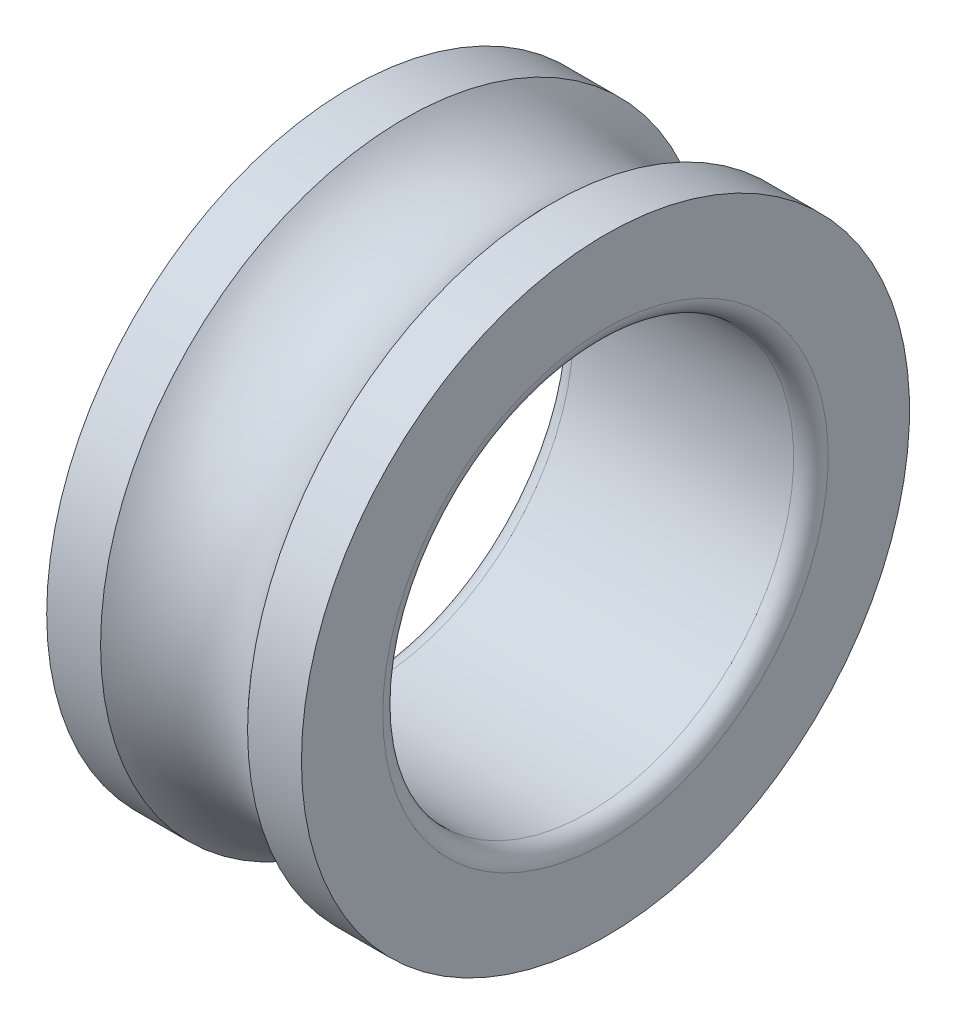
ISO-10303-21;
HEADER;
FILE_DESCRIPTION(('STEP AP214'),'2;1');
FILE_NAME('part.step','',(''),(''),'','','');
FILE_SCHEMA(('AUTOMOTIVE_DESIGN { 1 0 10303 214 1 1 1 1 }'));
ENDSEC;
DATA;
#1=APPLICATION_CONTEXT('core data for automotive mechanical design processes');
#2=APPLICATION_PROTOCOL_DEFINITION('international standard','automotive_design',2000,#1);
#3=PRODUCT_CONTEXT('',#1,'mechanical');
#4=PRODUCT('Part','Part','',(#3));
#5=PRODUCT_RELATED_PRODUCT_CATEGORY('part','',(#4));
#6=PRODUCT_DEFINITION_FORMATION('','',#4);
#7=PRODUCT_DEFINITION_CONTEXT('part definition',#1,'design');
#8=PRODUCT_DEFINITION('design','',#6,#7);
#9=PRODUCT_DEFINITION_SHAPE('','',#8);
#10=(LENGTH_UNIT() NAMED_UNIT(*) SI_UNIT(.MILLI.,.METRE.));
#11=(NAMED_UNIT(*) PLANE_ANGLE_UNIT() SI_UNIT($,.RADIAN.));
#12=(NAMED_UNIT(*) SI_UNIT($,.STERADIAN.) SOLID_ANGLE_UNIT());
#13=UNCERTAINTY_MEASURE_WITH_UNIT(LENGTH_MEASURE(1.E-05),#10,'distance_accuracy_value','');
#14=(GEOMETRIC_REPRESENTATION_CONTEXT(3) GLOBAL_UNCERTAINTY_ASSIGNED_CONTEXT((#13)) GLOBAL_UNIT_ASSIGNED_CONTEXT((#10,
#11,#12)) REPRESENTATION_CONTEXT('',''));
#15=CARTESIAN_POINT('',(0.,0.,0.));
#16=DIRECTION('',(0.,0.,1.));
#17=DIRECTION('',(1.,0.,0.));
#18=AXIS2_PLACEMENT_3D('',#15,#16,#17);
#19=CARTESIAN_POINT('',(-15.5,37.,0.));
#20=DIRECTION('',(1.,0.,0.));
#21=DIRECTION('',(0.,0.,-1.));
#22=AXIS2_PLACEMENT_3D('',#19,#20,#21);
#23=PLANE('',#22);
#24=CARTESIAN_POINT('',(-15.5,0.,0.));
#25=DIRECTION('',(-1.,0.,0.));
#26=DIRECTION('',(0.,0.,1.));
#27=AXIS2_PLACEMENT_3D('',#24,#25,#26);
#28=CIRCLE('',#27,27.1);
#29=CARTESIAN_POINT('',(-15.5,0.,27.1));
#30=VERTEX_POINT('',#29);
#31=EDGE_CURVE('E10',#30,#30,#28,.T.);
#32=ORIENTED_EDGE('',*,*,#31,.F.);
#33=EDGE_LOOP('',(#32));
#34=FACE_BOUND('',#33,.T.);
#35=CARTESIAN_POINT('',(-15.5,0.,0.));
#36=DIRECTION('',(-1.,0.,0.));
#37=DIRECTION('',(0.,0.,1.));
#38=AXIS2_PLACEMENT_3D('',#35,#36,#37);
#39=CIRCLE('',#38,37.);
#40=CARTESIAN_POINT('',(-15.5,0.,37.));
#41=VERTEX_POINT('',#40);
#42=EDGE_CURVE('E72',#41,#41,#39,.T.);
#43=ORIENTED_EDGE('',*,*,#42,.T.);
#44=EDGE_LOOP('',(#43));
#45=FACE_BOUND('',#44,.T.);
#46=ADVANCED_FACE('F37',(#34,#45),#23,.F.);
#47=CARTESIAN_POINT('',(-13.4,0.,0.));
#48=DIRECTION('',(-1.,0.,0.));
#49=DIRECTION('',(0.,0.,1.));
#50=AXIS2_PLACEMENT_3D('',#47,#48,#49);
#51=TOROIDAL_SURFACE('',#50,27.1,2.1);
#52=CARTESIAN_POINT('',(-13.4,0.,0.));
#53=DIRECTION('',(-1.,0.,0.));
#54=DIRECTION('',(0.,0.,1.));
#55=AXIS2_PLACEMENT_3D('',#52,#53,#54);
#56=CIRCLE('',#55,25.);
#57=CARTESIAN_POINT('',(-13.4,0.,25.));
#58=VERTEX_POINT('',#57);
#59=EDGE_CURVE('E44',#58,#58,#56,.T.);
#60=ORIENTED_EDGE('',*,*,#59,.F.);
#61=EDGE_LOOP('',(#60));
#62=FACE_BOUND('',#61,.T.);
#63=ORIENTED_EDGE('',*,*,#31,.T.);
#64=EDGE_LOOP('',(#63));
#65=FACE_BOUND('',#64,.T.);
#66=ADVANCED_FACE('F110',(#62,#65),#51,.T.);
#67=CARTESIAN_POINT('',(-22.7189323431548,0.,0.));
#68=DIRECTION('',(-1.,0.,0.));
#69=DIRECTION('',(0.,0.,1.));
#70=AXIS2_PLACEMENT_3D('',#67,#68,#69);
#71=CYLINDRICAL_SURFACE('',#70,25.);
#72=CARTESIAN_POINT('',(13.4,0.,0.));
#73=DIRECTION('',(-1.,0.,0.));
#74=DIRECTION('',(0.,0.,1.));
#75=AXIS2_PLACEMENT_3D('',#72,#73,#74);
#76=CIRCLE('',#75,25.);
#77=CARTESIAN_POINT('',(13.4,0.,25.));
#78=VERTEX_POINT('',#77);
#79=EDGE_CURVE('E49',#78,#78,#76,.T.);
#80=ORIENTED_EDGE('',*,*,#79,.F.);
#81=EDGE_LOOP('',(#80));
#82=FACE_BOUND('',#81,.T.);
#83=ORIENTED_EDGE('',*,*,#59,.T.);
#84=EDGE_LOOP('',(#83));
#85=FACE_BOUND('',#84,.T.);
#86=ADVANCED_FACE('F105',(#82,#85),#71,.F.);
#87=CARTESIAN_POINT('',(13.4,0.,0.));
#88=DIRECTION('',(-1.,0.,0.));
#89=DIRECTION('',(0.,0.,1.));
#90=AXIS2_PLACEMENT_3D('',#87,#88,#89);
#91=TOROIDAL_SURFACE('',#90,27.1,2.1);
#92=CARTESIAN_POINT('',(15.5,0.,0.));
#93=DIRECTION('',(-1.,0.,0.));
#94=DIRECTION('',(0.,0.,1.));
#95=AXIS2_PLACEMENT_3D('',#92,#93,#94);
#96=CIRCLE('',#95,27.1);
#97=CARTESIAN_POINT('',(15.5,0.,27.1));
#98=VERTEX_POINT('',#97);
#99=EDGE_CURVE('E54',#98,#98,#96,.T.);
#100=ORIENTED_EDGE('',*,*,#99,.F.);
#101=EDGE_LOOP('',(#100));
#102=FACE_BOUND('',#101,.T.);
#103=ORIENTED_EDGE('',*,*,#79,.T.);
#104=EDGE_LOOP('',(#103));
#105=FACE_BOUND('',#104,.T.);
#106=ADVANCED_FACE('F99',(#102,#105),#91,.T.);
#107=CARTESIAN_POINT('',(15.5,37.,0.));
#108=DIRECTION('',(-1.,0.,0.));
#109=DIRECTION('',(0.,0.,1.));
#110=AXIS2_PLACEMENT_3D('',#107,#108,#109);
#111=PLANE('',#110);
#112=CARTESIAN_POINT('',(15.5,0.,0.));
#113=DIRECTION('',(-1.,0.,0.));
#114=DIRECTION('',(0.,0.,1.));
#115=AXIS2_PLACEMENT_3D('',#112,#113,#114);
#116=CIRCLE('',#115,37.);
#117=CARTESIAN_POINT('',(15.5,0.,37.));
#118=VERTEX_POINT('',#117);
#119=EDGE_CURVE('E60',#118,#118,#116,.T.);
#120=ORIENTED_EDGE('',*,*,#119,.F.);
#121=EDGE_LOOP('',(#120));
#122=FACE_BOUND('',#121,.T.);
#123=ORIENTED_EDGE('',*,*,#99,.T.);
#124=EDGE_LOOP('',(#123));
#125=FACE_BOUND('',#124,.T.);
#126=ADVANCED_FACE('F93',(#122,#125),#111,.F.);
#127=CARTESIAN_POINT('',(-22.7189323431548,0.,0.));
#128=DIRECTION('',(-1.,0.,0.));
#129=DIRECTION('',(0.,0.,1.));
#130=AXIS2_PLACEMENT_3D('',#127,#128,#129);
#131=CYLINDRICAL_SURFACE('',#130,37.);
#132=CARTESIAN_POINT('',(8.94427190999916,0.,0.));
#133=DIRECTION('',(-1.,0.,0.));
#134=DIRECTION('',(0.,0.,1.));
#135=AXIS2_PLACEMENT_3D('',#132,#133,#134);
#136=CIRCLE('',#135,37.);
#137=CARTESIAN_POINT('',(8.94427190999916,0.,37.));
#138=VERTEX_POINT('',#137);
#139=EDGE_CURVE('E64',#138,#138,#136,.T.);
#140=ORIENTED_EDGE('',*,*,#139,.F.);
#141=EDGE_LOOP('',(#140));
#142=FACE_BOUND('',#141,.T.);
#143=ORIENTED_EDGE('',*,*,#119,.T.);
#144=EDGE_LOOP('',(#143));
#145=FACE_BOUND('',#144,.T.);
#146=ADVANCED_FACE('F87',(#142,#145),#131,.T.);
#147=CARTESIAN_POINT('',(0.,0.,0.));
#148=DIRECTION('',(-1.,0.,0.));
#149=DIRECTION('',(0.,0.,1.));
#150=AXIS2_PLACEMENT_3D('',#147,#148,#149);
#151=TOROIDAL_SURFACE('',#150,45.,12.);
#152=CARTESIAN_POINT('',(-8.94427190999916,0.,0.));
#153=DIRECTION('',(-1.,0.,0.));
#154=DIRECTION('',(0.,0.,1.));
#155=AXIS2_PLACEMENT_3D('',#152,#153,#154);
#156=CIRCLE('',#155,37.);
#157=CARTESIAN_POINT('',(-8.94427190999916,0.,37.));
#158=VERTEX_POINT('',#157);
#159=EDGE_CURVE('E68',#158,#158,#156,.T.);
#160=ORIENTED_EDGE('',*,*,#159,.F.);
#161=EDGE_LOOP('',(#160));
#162=FACE_BOUND('',#161,.T.);
#163=ORIENTED_EDGE('',*,*,#139,.T.);
#164=EDGE_LOOP('',(#163));
#165=FACE_BOUND('',#164,.T.);
#166=ADVANCED_FACE('F81',(#162,#165),#151,.F.);
#167=CARTESIAN_POINT('',(-22.7189323431548,0.,0.));
#168=DIRECTION('',(-1.,0.,0.));
#169=DIRECTION('',(0.,0.,1.));
#170=AXIS2_PLACEMENT_3D('',#167,#168,#169);
#171=CYLINDRICAL_SURFACE('',#170,37.);
#172=ORIENTED_EDGE('',*,*,#42,.F.);
#173=EDGE_LOOP('',(#172));
#174=FACE_BOUND('',#173,.T.);
#175=ORIENTED_EDGE('',*,*,#159,.T.);
#176=EDGE_LOOP('',(#175));
#177=FACE_BOUND('',#176,.T.);
#178=ADVANCED_FACE('F78',(#174,#177),#171,.T.);
#179=CLOSED_SHELL('',(#46,#66,#86,#106,#126,#146,#166,#178));
#180=MANIFOLD_SOLID_BREP('B2',#179);
#181=ADVANCED_BREP_SHAPE_REPRESENTATION('',(#18,#180),#14);
#182=SHAPE_DEFINITION_REPRESENTATION(#9,#181);
ENDSEC;
END-ISO-10303-21;
